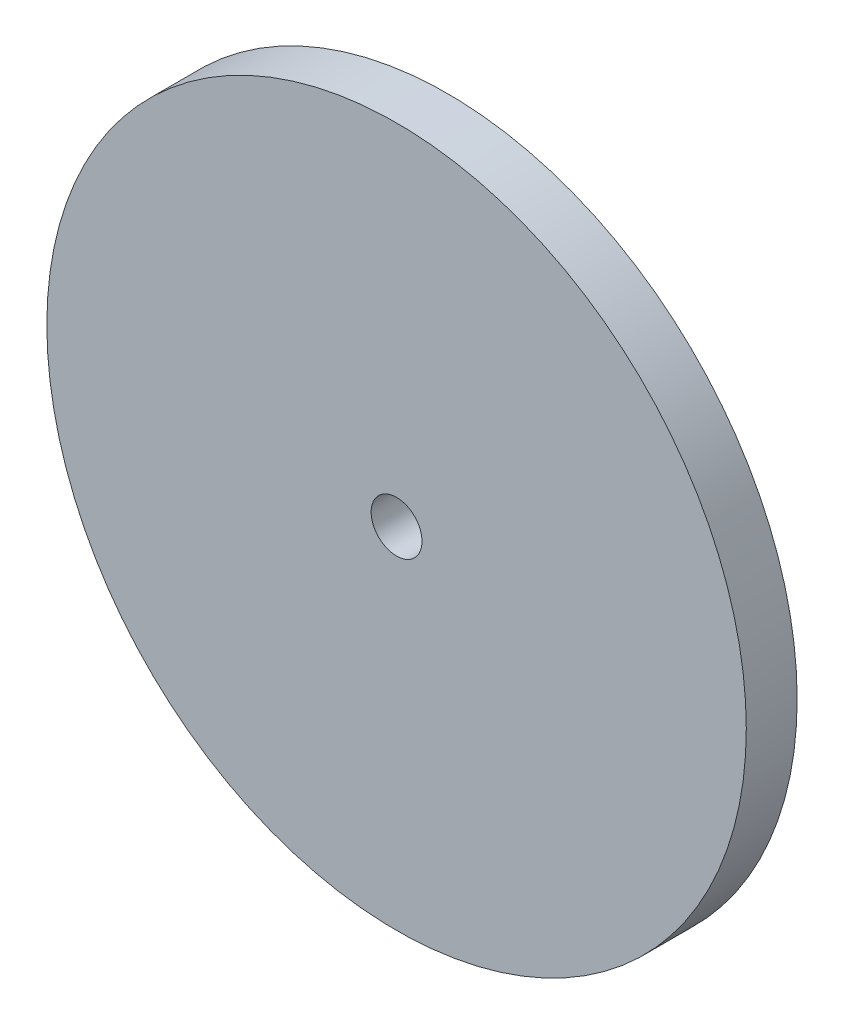
ISO-10303-21;
HEADER;
FILE_DESCRIPTION(('STEP AP214'),'2;1');
FILE_NAME('part.step','',(''),(''),'','','');
FILE_SCHEMA(('AUTOMOTIVE_DESIGN { 1 0 10303 214 1 1 1 1 }'));
ENDSEC;
DATA;
#1=APPLICATION_CONTEXT('core data for automotive mechanical design processes');
#2=APPLICATION_PROTOCOL_DEFINITION('international standard','automotive_design',2000,#1);
#3=PRODUCT_CONTEXT('',#1,'mechanical');
#4=PRODUCT('Part','Part','',(#3));
#5=PRODUCT_RELATED_PRODUCT_CATEGORY('part','',(#4));
#6=PRODUCT_DEFINITION_FORMATION('','',#4);
#7=PRODUCT_DEFINITION_CONTEXT('part definition',#1,'design');
#8=PRODUCT_DEFINITION('design','',#6,#7);
#9=PRODUCT_DEFINITION_SHAPE('','',#8);
#10=(LENGTH_UNIT() NAMED_UNIT(*) SI_UNIT(.MILLI.,.METRE.));
#11=(NAMED_UNIT(*) PLANE_ANGLE_UNIT() SI_UNIT($,.RADIAN.));
#12=(NAMED_UNIT(*) SI_UNIT($,.STERADIAN.) SOLID_ANGLE_UNIT());
#13=UNCERTAINTY_MEASURE_WITH_UNIT(LENGTH_MEASURE(1.E-05),#10,'distance_accuracy_value','');
#14=(GEOMETRIC_REPRESENTATION_CONTEXT(3) GLOBAL_UNCERTAINTY_ASSIGNED_CONTEXT((#13)) GLOBAL_UNIT_ASSIGNED_CONTEXT((#10,
#11,#12)) REPRESENTATION_CONTEXT('',''));
#15=CARTESIAN_POINT('',(0.,0.,0.));
#16=DIRECTION('',(0.,0.,1.));
#17=DIRECTION('',(1.,0.,0.));
#18=AXIS2_PLACEMENT_3D('',#15,#16,#17);
#19=CARTESIAN_POINT('',(0.,0.,4.));
#20=DIRECTION('',(0.,0.,-1.));
#21=DIRECTION('',(-1.,0.,0.));
#22=AXIS2_PLACEMENT_3D('',#19,#20,#21);
#23=CYLINDRICAL_SURFACE('',#22,27.5);
#24=CARTESIAN_POINT('',(0.,0.,4.));
#25=DIRECTION('',(0.,0.,1.));
#26=DIRECTION('',(1.,0.,0.));
#27=AXIS2_PLACEMENT_3D('',#24,#25,#26);
#28=CIRCLE('',#27,27.5);
#29=CARTESIAN_POINT('',(27.5,0.,4.));
#30=VERTEX_POINT('',#29);
#31=EDGE_CURVE('E10',#30,#30,#28,.T.);
#32=ORIENTED_EDGE('',*,*,#31,.F.);
#33=EDGE_LOOP('',(#32));
#34=FACE_BOUND('',#33,.T.);
#35=CARTESIAN_POINT('',(0.,0.,0.));
#36=DIRECTION('',(0.,0.,1.));
#37=DIRECTION('',(1.,0.,0.));
#38=AXIS2_PLACEMENT_3D('',#35,#36,#37);
#39=CIRCLE('',#38,27.5);
#40=CARTESIAN_POINT('',(27.5,0.,0.));
#41=VERTEX_POINT('',#40);
#42=EDGE_CURVE('E34',#41,#41,#39,.T.);
#43=ORIENTED_EDGE('',*,*,#42,.T.);
#44=EDGE_LOOP('',(#43));
#45=FACE_BOUND('',#44,.T.);
#46=ADVANCED_FACE('F31',(#34,#45),#23,.T.);
#47=CARTESIAN_POINT('',(0.,0.,4.));
#48=DIRECTION('',(0.,0.,1.));
#49=DIRECTION('',(1.,0.,0.));
#50=AXIS2_PLACEMENT_3D('',#47,#48,#49);
#51=PLANE('',#50);
#52=CARTESIAN_POINT('',(0.,0.,4.));
#53=DIRECTION('',(0.,0.,1.));
#54=DIRECTION('',(1.,0.,0.));
#55=AXIS2_PLACEMENT_3D('',#52,#53,#54);
#56=CIRCLE('',#55,2.);
#57=CARTESIAN_POINT('',(2.,0.,4.));
#58=VERTEX_POINT('',#57);
#59=EDGE_CURVE('E43',#58,#58,#56,.T.);
#60=ORIENTED_EDGE('',*,*,#59,.F.);
#61=EDGE_LOOP('',(#60));
#62=FACE_BOUND('',#61,.T.);
#63=ORIENTED_EDGE('',*,*,#31,.T.);
#64=EDGE_LOOP('',(#63));
#65=FACE_BOUND('',#64,.T.);
#66=ADVANCED_FACE('F58',(#62,#65),#51,.T.);
#67=CARTESIAN_POINT('',(0.,0.,0.));
#68=DIRECTION('',(0.,0.,1.));
#69=DIRECTION('',(1.,0.,0.));
#70=AXIS2_PLACEMENT_3D('',#67,#68,#69);
#71=PLANE('',#70);
#72=CARTESIAN_POINT('',(0.,0.,0.));
#73=DIRECTION('',(0.,0.,1.));
#74=DIRECTION('',(1.,0.,0.));
#75=AXIS2_PLACEMENT_3D('',#72,#73,#74);
#76=CIRCLE('',#75,2.);
#77=CARTESIAN_POINT('',(2.,0.,0.));
#78=VERTEX_POINT('',#77);
#79=EDGE_CURVE('E41',#78,#78,#76,.T.);
#80=ORIENTED_EDGE('',*,*,#79,.T.);
#81=EDGE_LOOP('',(#80));
#82=FACE_BOUND('',#81,.T.);
#83=ORIENTED_EDGE('',*,*,#42,.F.);
#84=EDGE_LOOP('',(#83));
#85=FACE_BOUND('',#84,.T.);
#86=ADVANCED_FACE('F49',(#82,#85),#71,.F.);
#87=CARTESIAN_POINT('',(0.,0.,0.));
#88=DIRECTION('',(0.,0.,1.));
#89=DIRECTION('',(1.,0.,0.));
#90=AXIS2_PLACEMENT_3D('',#87,#88,#89);
#91=CYLINDRICAL_SURFACE('',#90,2.);
#92=ORIENTED_EDGE('',*,*,#79,.F.);
#93=EDGE_LOOP('',(#92));
#94=FACE_BOUND('',#93,.T.);
#95=ORIENTED_EDGE('',*,*,#59,.T.);
#96=EDGE_LOOP('',(#95));
#97=FACE_BOUND('',#96,.T.);
#98=ADVANCED_FACE('F52',(#94,#97),#91,.F.);
#99=CLOSED_SHELL('',(#46,#66,#86,#98));
#100=MANIFOLD_SOLID_BREP('B2',#99);
#101=ADVANCED_BREP_SHAPE_REPRESENTATION('',(#18,#100),#14);
#102=SHAPE_DEFINITION_REPRESENTATION(#9,#101);
ENDSEC;
END-ISO-10303-21;
